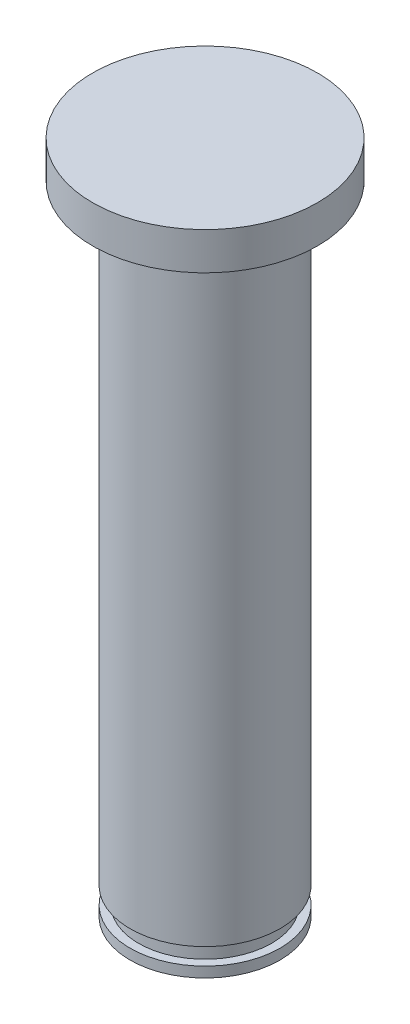
ISO-10303-21;
HEADER;
FILE_DESCRIPTION(('STEP AP214'),'2;1');
FILE_NAME('part.step','',(''),(''),'','','');
FILE_SCHEMA(('AUTOMOTIVE_DESIGN { 1 0 10303 214 1 1 1 1 }'));
ENDSEC;
DATA;
#1=APPLICATION_CONTEXT('core data for automotive mechanical design processes');
#2=APPLICATION_PROTOCOL_DEFINITION('international standard','automotive_design',2000,#1);
#3=PRODUCT_CONTEXT('',#1,'mechanical');
#4=PRODUCT('Part','Part','',(#3));
#5=PRODUCT_RELATED_PRODUCT_CATEGORY('part','',(#4));
#6=PRODUCT_DEFINITION_FORMATION('','',#4);
#7=PRODUCT_DEFINITION_CONTEXT('part definition',#1,'design');
#8=PRODUCT_DEFINITION('design','',#6,#7);
#9=PRODUCT_DEFINITION_SHAPE('','',#8);
#10=(LENGTH_UNIT() NAMED_UNIT(*) SI_UNIT(.MILLI.,.METRE.));
#11=(NAMED_UNIT(*) PLANE_ANGLE_UNIT() SI_UNIT($,.RADIAN.));
#12=(NAMED_UNIT(*) SI_UNIT($,.STERADIAN.) SOLID_ANGLE_UNIT());
#13=UNCERTAINTY_MEASURE_WITH_UNIT(LENGTH_MEASURE(1.E-05),#10,'distance_accuracy_value','');
#14=(GEOMETRIC_REPRESENTATION_CONTEXT(3) GLOBAL_UNCERTAINTY_ASSIGNED_CONTEXT((#13)) GLOBAL_UNIT_ASSIGNED_CONTEXT((#10,
#11,#12)) REPRESENTATION_CONTEXT('',''));
#15=CARTESIAN_POINT('',(0.,0.,0.));
#16=DIRECTION('',(0.,0.,1.));
#17=DIRECTION('',(1.,0.,0.));
#18=AXIS2_PLACEMENT_3D('',#15,#16,#17);
#19=CARTESIAN_POINT('',(125.,-184.,45.));
#20=DIRECTION('',(0.,1.,0.));
#21=DIRECTION('',(0.,0.,-1.));
#22=AXIS2_PLACEMENT_3D('',#19,#20,#21);
#23=PLANE('',#22);
#24=CARTESIAN_POINT('',(125.,-184.,45.));
#25=DIRECTION('',(0.,-1.,0.));
#26=DIRECTION('',(1.,0.,0.));
#27=AXIS2_PLACEMENT_3D('',#24,#25,#26);
#28=CIRCLE('',#27,4.);
#29=CARTESIAN_POINT('',(129.,-184.,45.));
#30=VERTEX_POINT('',#29);
#31=EDGE_CURVE('E11',#30,#30,#28,.T.);
#32=ORIENTED_EDGE('',*,*,#31,.T.);
#33=EDGE_LOOP('',(#32));
#34=FACE_BOUND('',#33,.T.);
#35=ADVANCED_FACE('F16',(#34),#23,.F.);
#36=CARTESIAN_POINT('',(125.,-184.,45.));
#37=DIRECTION('',(0.,1.,0.));
#38=DIRECTION('',(1.,0.,0.));
#39=AXIS2_PLACEMENT_3D('',#36,#37,#38);
#40=CYLINDRICAL_SURFACE('',#39,4.);
#41=DIRECTION('',(0.,1.,0.));
#42=VECTOR('',#41,1.);
#43=CARTESIAN_POINT('',(129.,-184.,45.));
#44=LINE('',#43,#42);
#45=CARTESIAN_POINT('',(129.,-183.45,45.));
#46=VERTEX_POINT('',#45);
#47=EDGE_CURVE('E19',#30,#46,#44,.T.);
#48=ORIENTED_EDGE('',*,*,#47,.F.);
#49=ORIENTED_EDGE('',*,*,#31,.F.);
#50=ORIENTED_EDGE('',*,*,#47,.T.);
#51=CARTESIAN_POINT('',(125.,-183.45,45.));
#52=DIRECTION('',(0.,-1.,0.));
#53=DIRECTION('',(1.,0.,0.));
#54=AXIS2_PLACEMENT_3D('',#51,#52,#53);
#55=CIRCLE('',#54,4.);
#56=EDGE_CURVE('E63',#46,#46,#55,.T.);
#57=ORIENTED_EDGE('',*,*,#56,.T.);
#58=EDGE_LOOP('',(#48,#49,#50,#57));
#59=FACE_BOUND('',#58,.T.);
#60=ADVANCED_FACE('F130',(#59),#40,.T.);
#61=CARTESIAN_POINT('',(125.,-183.45,45.));
#62=DIRECTION('',(0.,1.,0.));
#63=DIRECTION('',(0.,0.,-1.));
#64=AXIS2_PLACEMENT_3D('',#61,#62,#63);
#65=PLANE('',#64);
#66=CARTESIAN_POINT('',(125.,-183.45,45.));
#67=DIRECTION('',(0.,-1.,0.));
#68=DIRECTION('',(1.,0.,0.));
#69=AXIS2_PLACEMENT_3D('',#66,#67,#68);
#70=CIRCLE('',#69,3.55);
#71=CARTESIAN_POINT('',(128.55,-183.45,45.));
#72=VERTEX_POINT('',#71);
#73=EDGE_CURVE('E59',#72,#72,#70,.T.);
#74=ORIENTED_EDGE('',*,*,#73,.T.);
#75=EDGE_LOOP('',(#74));
#76=FACE_BOUND('',#75,.T.);
#77=ORIENTED_EDGE('',*,*,#56,.F.);
#78=EDGE_LOOP('',(#77));
#79=FACE_BOUND('',#78,.T.);
#80=ADVANCED_FACE('F60',(#76,#79),#65,.T.);
#81=CARTESIAN_POINT('',(125.,-183.55,45.));
#82=DIRECTION('',(0.,1.,0.));
#83=DIRECTION('',(1.,0.,0.));
#84=AXIS2_PLACEMENT_3D('',#81,#82,#83);
#85=CYLINDRICAL_SURFACE('',#84,3.55);
#86=DIRECTION('',(0.,1.,0.));
#87=VECTOR('',#86,1.);
#88=CARTESIAN_POINT('',(128.55,-183.55,45.));
#89=LINE('',#88,#87);
#90=CARTESIAN_POINT('',(128.55,-182.55,45.));
#91=VERTEX_POINT('',#90);
#92=EDGE_CURVE('E54',#72,#91,#89,.T.);
#93=ORIENTED_EDGE('',*,*,#92,.F.);
#94=ORIENTED_EDGE('',*,*,#73,.F.);
#95=ORIENTED_EDGE('',*,*,#92,.T.);
#96=CARTESIAN_POINT('',(125.,-182.55,45.));
#97=DIRECTION('',(0.,-1.,0.));
#98=DIRECTION('',(1.,0.,0.));
#99=AXIS2_PLACEMENT_3D('',#96,#97,#98);
#100=CIRCLE('',#99,3.55);
#101=EDGE_CURVE('E70',#91,#91,#100,.T.);
#102=ORIENTED_EDGE('',*,*,#101,.T.);
#103=EDGE_LOOP('',(#93,#94,#95,#102));
#104=FACE_BOUND('',#103,.T.);
#105=ADVANCED_FACE('F138',(#104),#85,.T.);
#106=CARTESIAN_POINT('',(125.,-182.55,45.));
#107=DIRECTION('',(0.,1.,0.));
#108=DIRECTION('',(0.,0.,-1.));
#109=AXIS2_PLACEMENT_3D('',#106,#107,#108);
#110=PLANE('',#109);
#111=ORIENTED_EDGE('',*,*,#101,.F.);
#112=EDGE_LOOP('',(#111));
#113=FACE_BOUND('',#112,.T.);
#114=CARTESIAN_POINT('',(125.,-182.55,45.));
#115=DIRECTION('',(0.,-1.,0.));
#116=DIRECTION('',(1.,0.,0.));
#117=AXIS2_PLACEMENT_3D('',#114,#115,#116);
#118=CIRCLE('',#117,4.);
#119=CARTESIAN_POINT('',(129.,-182.55,45.));
#120=VERTEX_POINT('',#119);
#121=EDGE_CURVE('E78',#120,#120,#118,.T.);
#122=ORIENTED_EDGE('',*,*,#121,.T.);
#123=EDGE_LOOP('',(#122));
#124=FACE_BOUND('',#123,.T.);
#125=ADVANCED_FACE('F124',(#113,#124),#110,.F.);
#126=CARTESIAN_POINT('',(125.,-184.,45.));
#127=DIRECTION('',(0.,1.,0.));
#128=DIRECTION('',(1.,0.,0.));
#129=AXIS2_PLACEMENT_3D('',#126,#127,#128);
#130=CYLINDRICAL_SURFACE('',#129,4.);
#131=ORIENTED_EDGE('',*,*,#121,.F.);
#132=DIRECTION('',(0.,1.,0.));
#133=VECTOR('',#132,1.);
#134=CARTESIAN_POINT('',(129.,-184.,45.));
#135=LINE('',#134,#133);
#136=CARTESIAN_POINT('',(129.,-150.,45.));
#137=VERTEX_POINT('',#136);
#138=EDGE_CURVE('E73',#120,#137,#135,.T.);
#139=ORIENTED_EDGE('',*,*,#138,.T.);
#140=CARTESIAN_POINT('',(125.,-150.,45.));
#141=DIRECTION('',(0.,-1.,0.));
#142=DIRECTION('',(1.,0.,0.));
#143=AXIS2_PLACEMENT_3D('',#140,#141,#142);
#144=CIRCLE('',#143,4.);
#145=EDGE_CURVE('E82',#137,#137,#144,.T.);
#146=ORIENTED_EDGE('',*,*,#145,.T.);
#147=ORIENTED_EDGE('',*,*,#138,.F.);
#148=EDGE_LOOP('',(#131,#139,#146,#147));
#149=FACE_BOUND('',#148,.T.);
#150=ADVANCED_FACE('F114',(#149),#130,.T.);
#151=CARTESIAN_POINT('',(125.,-150.,45.));
#152=DIRECTION('',(0.,1.,0.));
#153=DIRECTION('',(0.,0.,-1.));
#154=AXIS2_PLACEMENT_3D('',#151,#152,#153);
#155=PLANE('',#154);
#156=ORIENTED_EDGE('',*,*,#145,.F.);
#157=EDGE_LOOP('',(#156));
#158=FACE_BOUND('',#157,.T.);
#159=CARTESIAN_POINT('',(125.,-150.,45.));
#160=DIRECTION('',(0.,-1.,0.));
#161=DIRECTION('',(1.,0.,0.));
#162=AXIS2_PLACEMENT_3D('',#159,#160,#161);
#163=CIRCLE('',#162,6.);
#164=CARTESIAN_POINT('',(131.,-150.,45.));
#165=VERTEX_POINT('',#164);
#166=EDGE_CURVE('E83',#165,#165,#163,.T.);
#167=ORIENTED_EDGE('',*,*,#166,.T.);
#168=EDGE_LOOP('',(#167));
#169=FACE_BOUND('',#168,.T.);
#170=ADVANCED_FACE('F111',(#158,#169),#155,.F.);
#171=CARTESIAN_POINT('',(125.,-148.,45.));
#172=DIRECTION('',(0.,1.,0.));
#173=DIRECTION('',(0.,0.,-1.));
#174=AXIS2_PLACEMENT_3D('',#171,#172,#173);
#175=PLANE('',#174);
#176=CARTESIAN_POINT('',(125.,-148.,45.));
#177=DIRECTION('',(0.,-1.,0.));
#178=DIRECTION('',(1.,0.,0.));
#179=AXIS2_PLACEMENT_3D('',#176,#177,#178);
#180=CIRCLE('',#179,6.);
#181=CARTESIAN_POINT('',(131.,-148.,45.));
#182=VERTEX_POINT('',#181);
#183=EDGE_CURVE('E87',#182,#182,#180,.T.);
#184=ORIENTED_EDGE('',*,*,#183,.F.);
#185=EDGE_LOOP('',(#184));
#186=FACE_BOUND('',#185,.T.);
#187=ADVANCED_FACE('F113',(#186),#175,.T.);
#188=CARTESIAN_POINT('',(125.,-150.,45.));
#189=DIRECTION('',(0.,1.,0.));
#190=DIRECTION('',(1.,0.,0.));
#191=AXIS2_PLACEMENT_3D('',#188,#189,#190);
#192=CYLINDRICAL_SURFACE('',#191,6.);
#193=DIRECTION('',(0.,1.,0.));
#194=VECTOR('',#193,1.);
#195=CARTESIAN_POINT('',(131.,-150.,45.));
#196=LINE('',#195,#194);
#197=EDGE_CURVE('E88',#165,#182,#196,.T.);
#198=ORIENTED_EDGE('',*,*,#197,.F.);
#199=ORIENTED_EDGE('',*,*,#166,.F.);
#200=ORIENTED_EDGE('',*,*,#197,.T.);
#201=ORIENTED_EDGE('',*,*,#183,.T.);
#202=EDGE_LOOP('',(#198,#199,#200,#201));
#203=FACE_BOUND('',#202,.T.);
#204=ADVANCED_FACE('F102',(#203),#192,.T.);
#205=CLOSED_SHELL('',(#35,#60,#80,#105,#125,#150,#170,#187,#204));
#206=MANIFOLD_SOLID_BREP('B1',#205);
#207=ADVANCED_BREP_SHAPE_REPRESENTATION('',(#18,#206),#14);
#208=SHAPE_DEFINITION_REPRESENTATION(#9,#207);
ENDSEC;
END-ISO-10303-21;
